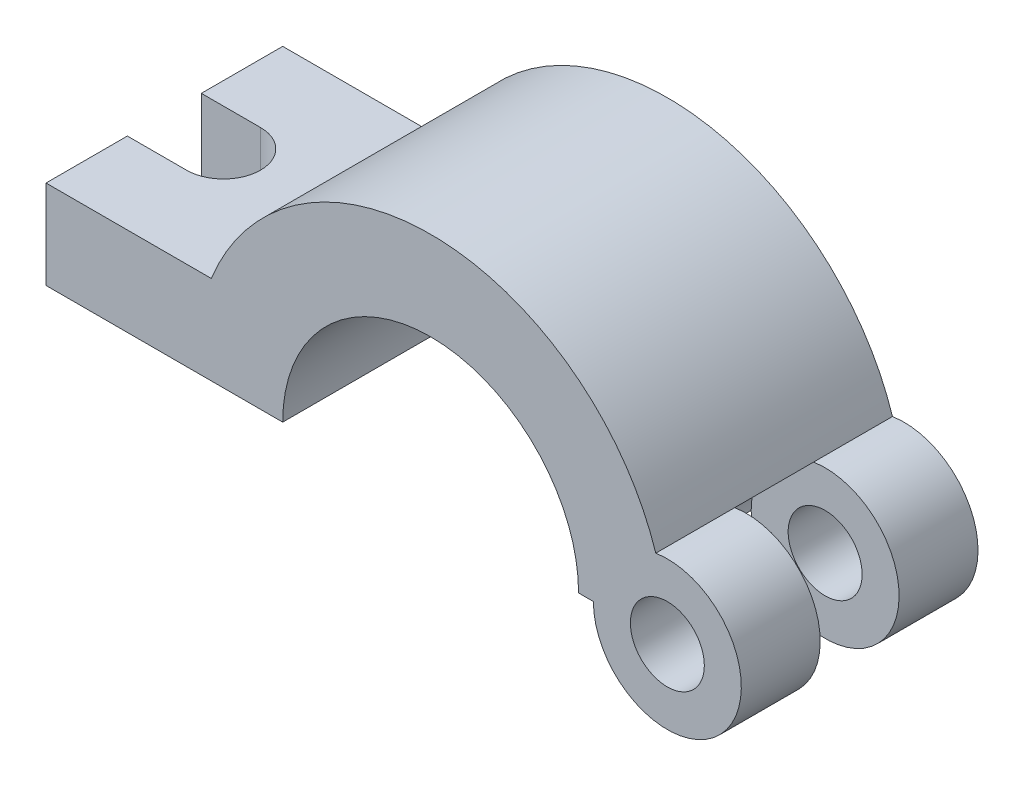
ISO-10303-21;
HEADER;
FILE_DESCRIPTION(('STEP AP214'),'2;1');
FILE_NAME('part.step','',(''),(''),'','','');
FILE_SCHEMA(('AUTOMOTIVE_DESIGN { 1 0 10303 214 1 1 1 1 }'));
ENDSEC;
DATA;
#1=APPLICATION_CONTEXT('core data for automotive mechanical design processes');
#2=APPLICATION_PROTOCOL_DEFINITION('international standard','automotive_design',2000,#1);
#3=PRODUCT_CONTEXT('',#1,'mechanical');
#4=PRODUCT('Part','Part','',(#3));
#5=PRODUCT_RELATED_PRODUCT_CATEGORY('part','',(#4));
#6=PRODUCT_DEFINITION_FORMATION('','',#4);
#7=PRODUCT_DEFINITION_CONTEXT('part definition',#1,'design');
#8=PRODUCT_DEFINITION('design','',#6,#7);
#9=PRODUCT_DEFINITION_SHAPE('','',#8);
#10=(LENGTH_UNIT() NAMED_UNIT(*) SI_UNIT(.MILLI.,.METRE.));
#11=(NAMED_UNIT(*) PLANE_ANGLE_UNIT() SI_UNIT($,.RADIAN.));
#12=(NAMED_UNIT(*) SI_UNIT($,.STERADIAN.) SOLID_ANGLE_UNIT());
#13=UNCERTAINTY_MEASURE_WITH_UNIT(LENGTH_MEASURE(1.E-05),#10,'distance_accuracy_value','');
#14=(GEOMETRIC_REPRESENTATION_CONTEXT(3) GLOBAL_UNCERTAINTY_ASSIGNED_CONTEXT((#13)) GLOBAL_UNIT_ASSIGNED_CONTEXT((#10,
#11,#12)) REPRESENTATION_CONTEXT('',''));
#15=CARTESIAN_POINT('',(0.,0.,0.));
#16=DIRECTION('',(0.,0.,1.));
#17=DIRECTION('',(1.,0.,0.));
#18=AXIS2_PLACEMENT_3D('',#15,#16,#17);
#19=CARTESIAN_POINT('',(0.,3.,4.));
#20=DIRECTION('',(0.,1.,0.));
#21=DIRECTION('',(-1.,0.,0.));
#22=AXIS2_PLACEMENT_3D('',#19,#20,#21);
#23=PLANE('',#22);
#24=CARTESIAN_POINT('',(-11.,3.,0.));
#25=DIRECTION('',(0.,1.,0.));
#26=DIRECTION('',(-1.,0.,0.));
#27=AXIS2_PLACEMENT_3D('',#24,#25,#26);
#28=CIRCLE('',#27,1.25);
#29=CARTESIAN_POINT('',(-11.,3.,1.25));
#30=VERTEX_POINT('',#29);
#31=CARTESIAN_POINT('',(-11.,3.,-1.25));
#32=VERTEX_POINT('',#31);
#33=EDGE_CURVE('E327',#30,#32,#28,.T.);
#34=ORIENTED_EDGE('',*,*,#33,.F.);
#35=DIRECTION('',(1.,0.,0.));
#36=VECTOR('',#35,1.);
#37=CARTESIAN_POINT('',(-13.,3.,1.25));
#38=LINE('',#37,#36);
#39=CARTESIAN_POINT('',(-13.,3.,1.25));
#40=VERTEX_POINT('',#39);
#41=EDGE_CURVE('E181',#40,#30,#38,.T.);
#42=ORIENTED_EDGE('',*,*,#41,.F.);
#43=DIRECTION('',(0.,0.,-1.));
#44=VECTOR('',#43,1.);
#45=CARTESIAN_POINT('',(-13.,3.,4.));
#46=LINE('',#45,#44);
#47=CARTESIAN_POINT('',(-13.,3.,4.));
#48=VERTEX_POINT('',#47);
#49=EDGE_CURVE('E46',#48,#40,#46,.T.);
#50=ORIENTED_EDGE('',*,*,#49,.F.);
#51=DIRECTION('',(1.,0.,0.));
#52=VECTOR('',#51,1.);
#53=CARTESIAN_POINT('',(0.,3.,4.));
#54=LINE('',#53,#52);
#55=CARTESIAN_POINT('',(-7.41619848709566,3.,4.));
#56=VERTEX_POINT('',#55);
#57=EDGE_CURVE('E209',#48,#56,#54,.T.);
#58=ORIENTED_EDGE('',*,*,#57,.T.);
#59=DIRECTION('',(0.,0.,-1.));
#60=VECTOR('',#59,1.);
#61=CARTESIAN_POINT('',(-7.41619848709566,3.,4.));
#62=LINE('',#61,#60);
#63=CARTESIAN_POINT('',(-7.41619848709566,3.,-4.));
#64=VERTEX_POINT('',#63);
#65=EDGE_CURVE('E11',#56,#64,#62,.T.);
#66=ORIENTED_EDGE('',*,*,#65,.T.);
#67=DIRECTION('',(1.,0.,0.));
#68=VECTOR('',#67,1.);
#69=CARTESIAN_POINT('',(0.,3.,-4.));
#70=LINE('',#69,#68);
#71=CARTESIAN_POINT('',(-13.,3.,-4.));
#72=VERTEX_POINT('',#71);
#73=EDGE_CURVE('E225',#72,#64,#70,.T.);
#74=ORIENTED_EDGE('',*,*,#73,.F.);
#75=CARTESIAN_POINT('',(-13.,3.,-1.25));
#76=VERTEX_POINT('',#75);
#77=EDGE_CURVE('E159',#76,#72,#46,.T.);
#78=ORIENTED_EDGE('',*,*,#77,.F.);
#79=DIRECTION('',(-1.,0.,0.));
#80=VECTOR('',#79,1.);
#81=CARTESIAN_POINT('',(-13.,3.,-1.25));
#82=LINE('',#81,#80);
#83=EDGE_CURVE('E138',#32,#76,#82,.T.);
#84=ORIENTED_EDGE('',*,*,#83,.F.);
#85=EDGE_LOOP('',(#34,#42,#50,#58,#66,#74,#78,#84));
#86=FACE_BOUND('',#85,.T.);
#87=ADVANCED_FACE('F37',(#86),#23,.T.);
#88=CARTESIAN_POINT('',(-13.,0.,4.));
#89=DIRECTION('',(-1.,0.,0.));
#90=DIRECTION('',(0.,0.,1.));
#91=AXIS2_PLACEMENT_3D('',#88,#89,#90);
#92=PLANE('',#91);
#93=ORIENTED_EDGE('',*,*,#49,.T.);
#94=DIRECTION('',(0.,-1.,0.));
#95=VECTOR('',#94,1.);
#96=CARTESIAN_POINT('',(-13.,40.4420799298589,1.25));
#97=LINE('',#96,#95);
#98=CARTESIAN_POINT('',(-13.,0.,1.25));
#99=VERTEX_POINT('',#98);
#100=EDGE_CURVE('E322',#40,#99,#97,.T.);
#101=ORIENTED_EDGE('',*,*,#100,.T.);
#102=DIRECTION('',(0.,0.,-1.));
#103=VECTOR('',#102,1.);
#104=CARTESIAN_POINT('',(-13.,0.,4.));
#105=LINE('',#104,#103);
#106=CARTESIAN_POINT('',(-13.,0.,4.));
#107=VERTEX_POINT('',#106);
#108=EDGE_CURVE('E155',#107,#99,#105,.T.);
#109=ORIENTED_EDGE('',*,*,#108,.F.);
#110=DIRECTION('',(0.,1.,0.));
#111=VECTOR('',#110,1.);
#112=CARTESIAN_POINT('',(-13.,0.,4.));
#113=LINE('',#112,#111);
#114=EDGE_CURVE('E213',#107,#48,#113,.T.);
#115=ORIENTED_EDGE('',*,*,#114,.T.);
#116=EDGE_LOOP('',(#93,#101,#109,#115));
#117=FACE_BOUND('',#116,.T.);
#118=ADVANCED_FACE('F283',(#117),#92,.T.);
#119=CARTESIAN_POINT('',(-13.,0.,-1.25));
#120=VERTEX_POINT('',#119);
#121=CARTESIAN_POINT('',(-13.,0.,-4.));
#122=VERTEX_POINT('',#121);
#123=EDGE_CURVE('E146',#120,#122,#105,.T.);
#124=ORIENTED_EDGE('',*,*,#123,.F.);
#125=DIRECTION('',(0.,-1.,0.));
#126=VECTOR('',#125,1.);
#127=CARTESIAN_POINT('',(-13.,40.4420799298589,-1.25));
#128=LINE('',#127,#126);
#129=EDGE_CURVE('E132',#76,#120,#128,.T.);
#130=ORIENTED_EDGE('',*,*,#129,.F.);
#131=ORIENTED_EDGE('',*,*,#77,.T.);
#132=DIRECTION('',(0.,1.,0.));
#133=VECTOR('',#132,1.);
#134=CARTESIAN_POINT('',(-13.,0.,-4.));
#135=LINE('',#134,#133);
#136=EDGE_CURVE('E154',#122,#72,#135,.T.);
#137=ORIENTED_EDGE('',*,*,#136,.F.);
#138=EDGE_LOOP('',(#124,#130,#131,#137));
#139=FACE_BOUND('',#138,.T.);
#140=ADVANCED_FACE('F152',(#139),#92,.T.);
#141=CARTESIAN_POINT('',(8.,0.,4.));
#142=DIRECTION('',(0.,0.,-1.));
#143=DIRECTION('',(-1.,0.,0.));
#144=AXIS2_PLACEMENT_3D('',#141,#142,#143);
#145=CYLINDRICAL_SURFACE('',#144,2.5);
#146=CARTESIAN_POINT('',(8.,0.,-1.33333333333333));
#147=DIRECTION('',(0.,0.,1.));
#148=DIRECTION('',(1.,0.,0.));
#149=AXIS2_PLACEMENT_3D('',#146,#147,#148);
#150=CIRCLE('',#149,2.5);
#151=CARTESIAN_POINT('',(5.5,0.,-1.33333333333333));
#152=VERTEX_POINT('',#151);
#153=CARTESIAN_POINT('',(7.609375,2.46929384832486,-1.33333333333333));
#154=VERTEX_POINT('',#153);
#155=EDGE_CURVE('E174',#152,#154,#150,.T.);
#156=ORIENTED_EDGE('',*,*,#155,.F.);
#157=DIRECTION('',(0.,0.,-1.));
#158=VECTOR('',#157,1.);
#159=CARTESIAN_POINT('',(5.5,0.,4.));
#160=LINE('',#159,#158);
#161=CARTESIAN_POINT('',(5.5,0.,-4.));
#162=VERTEX_POINT('',#161);
#163=EDGE_CURVE('E194',#152,#162,#160,.T.);
#164=ORIENTED_EDGE('',*,*,#163,.T.);
#165=CARTESIAN_POINT('',(8.,0.,-4.));
#166=DIRECTION('',(0.,0.,1.));
#167=DIRECTION('',(1.,0.,0.));
#168=AXIS2_PLACEMENT_3D('',#165,#166,#167);
#169=CIRCLE('',#168,2.5);
#170=CARTESIAN_POINT('',(7.609375,2.46929384832486,-4.));
#171=VERTEX_POINT('',#170);
#172=EDGE_CURVE('E190',#162,#171,#169,.T.);
#173=ORIENTED_EDGE('',*,*,#172,.T.);
#174=DIRECTION('',(0.,0.,-1.));
#175=VECTOR('',#174,1.);
#176=CARTESIAN_POINT('',(7.609375,2.46929384832486,0.));
#177=LINE('',#176,#175);
#178=EDGE_CURVE('E200',#154,#171,#177,.T.);
#179=ORIENTED_EDGE('',*,*,#178,.F.);
#180=EDGE_LOOP('',(#156,#164,#173,#179));
#181=FACE_BOUND('',#180,.T.);
#182=ADVANCED_FACE('F250',(#181),#145,.T.);
#183=CARTESIAN_POINT('',(8.,0.,-7.53553390593274));
#184=DIRECTION('',(0.,0.,1.));
#185=DIRECTION('',(1.,0.,0.));
#186=AXIS2_PLACEMENT_3D('',#183,#184,#185);
#187=CYLINDRICAL_SURFACE('',#186,1.25);
#188=CARTESIAN_POINT('',(8.,0.,-4.));
#189=DIRECTION('',(0.,0.,1.));
#190=DIRECTION('',(1.,0.,0.));
#191=AXIS2_PLACEMENT_3D('',#188,#189,#190);
#192=CIRCLE('',#191,1.25);
#193=CARTESIAN_POINT('',(9.25,0.,-4.));
#194=VERTEX_POINT('',#193);
#195=EDGE_CURVE('E187',#194,#194,#192,.F.);
#196=ORIENTED_EDGE('',*,*,#195,.T.);
#197=EDGE_LOOP('',(#196));
#198=FACE_BOUND('',#197,.T.);
#199=CARTESIAN_POINT('',(8.,0.,-1.33333333333333));
#200=DIRECTION('',(0.,0.,1.));
#201=DIRECTION('',(1.,0.,0.));
#202=AXIS2_PLACEMENT_3D('',#199,#200,#201);
#203=CIRCLE('',#202,1.25);
#204=CARTESIAN_POINT('',(9.25,0.,-1.33333333333333));
#205=VERTEX_POINT('',#204);
#206=EDGE_CURVE('E41',#205,#205,#203,.F.);
#207=ORIENTED_EDGE('',*,*,#206,.F.);
#208=EDGE_LOOP('',(#207));
#209=FACE_BOUND('',#208,.T.);
#210=ADVANCED_FACE('F273',(#198,#209),#187,.F.);
#211=CARTESIAN_POINT('',(0.,0.,4.));
#212=DIRECTION('',(0.,0.,-1.));
#213=DIRECTION('',(-1.,0.,0.));
#214=AXIS2_PLACEMENT_3D('',#211,#212,#213);
#215=CYLINDRICAL_SURFACE('',#214,8.);
#216=CARTESIAN_POINT('',(0.,0.,4.));
#217=DIRECTION('',(0.,0.,1.));
#218=DIRECTION('',(1.,0.,0.));
#219=AXIS2_PLACEMENT_3D('',#216,#217,#218);
#220=CIRCLE('',#219,8.);
#221=CARTESIAN_POINT('',(7.609375,2.46929384832486,4.));
#222=VERTEX_POINT('',#221);
#223=EDGE_CURVE('E207',#56,#222,#220,.F.);
#224=ORIENTED_EDGE('',*,*,#223,.T.);
#225=CARTESIAN_POINT('',(7.609375,2.46929384832486,1.33333333333333));
#226=VERTEX_POINT('',#225);
#227=EDGE_CURVE('E202',#222,#226,#177,.T.);
#228=ORIENTED_EDGE('',*,*,#227,.T.);
#229=EDGE_CURVE('E206',#226,#154,#177,.T.);
#230=ORIENTED_EDGE('',*,*,#229,.T.);
#231=ORIENTED_EDGE('',*,*,#178,.T.);
#232=CARTESIAN_POINT('',(0.,0.,-4.));
#233=DIRECTION('',(0.,0.,1.));
#234=DIRECTION('',(1.,0.,0.));
#235=AXIS2_PLACEMENT_3D('',#232,#233,#234);
#236=CIRCLE('',#235,8.);
#237=EDGE_CURVE('E205',#64,#171,#236,.F.);
#238=ORIENTED_EDGE('',*,*,#237,.F.);
#239=ORIENTED_EDGE('',*,*,#65,.F.);
#240=EDGE_LOOP('',(#224,#228,#230,#231,#238,#239));
#241=FACE_BOUND('',#240,.T.);
#242=ADVANCED_FACE('F39',(#241),#215,.T.);
#243=CARTESIAN_POINT('',(0.,0.,4.));
#244=DIRECTION('',(0.,1.,0.));
#245=DIRECTION('',(0.,0.,1.));
#246=AXIS2_PLACEMENT_3D('',#243,#244,#245);
#247=PLANE('',#246);
#248=CARTESIAN_POINT('',(5.5,0.,4.));
#249=VERTEX_POINT('',#248);
#250=CARTESIAN_POINT('',(5.5,0.,1.33333333333333));
#251=VERTEX_POINT('',#250);
#252=EDGE_CURVE('E197',#249,#251,#160,.T.);
#253=ORIENTED_EDGE('',*,*,#252,.F.);
#254=DIRECTION('',(1.,0.,0.));
#255=VECTOR('',#254,1.);
#256=CARTESIAN_POINT('',(0.,0.,4.));
#257=LINE('',#256,#255);
#258=CARTESIAN_POINT('',(5.,0.,4.));
#259=VERTEX_POINT('',#258);
#260=EDGE_CURVE('E220',#259,#249,#257,.T.);
#261=ORIENTED_EDGE('',*,*,#260,.F.);
#262=DIRECTION('',(0.,0.,-1.));
#263=VECTOR('',#262,1.);
#264=CARTESIAN_POINT('',(5.,0.,4.));
#265=LINE('',#264,#263);
#266=CARTESIAN_POINT('',(5.,0.,-4.));
#267=VERTEX_POINT('',#266);
#268=EDGE_CURVE('E161',#259,#267,#265,.T.);
#269=ORIENTED_EDGE('',*,*,#268,.T.);
#270=DIRECTION('',(1.,0.,0.));
#271=VECTOR('',#270,1.);
#272=CARTESIAN_POINT('',(0.,0.,-4.));
#273=LINE('',#272,#271);
#274=EDGE_CURVE('E210',#267,#162,#273,.T.);
#275=ORIENTED_EDGE('',*,*,#274,.T.);
#276=ORIENTED_EDGE('',*,*,#163,.F.);
#277=EDGE_CURVE('E201',#251,#152,#160,.T.);
#278=ORIENTED_EDGE('',*,*,#277,.F.);
#279=EDGE_LOOP('',(#253,#261,#269,#275,#276,#278));
#280=FACE_BOUND('',#279,.T.);
#281=ADVANCED_FACE('F239',(#280),#247,.F.);
#282=CARTESIAN_POINT('',(0.,0.,4.));
#283=DIRECTION('',(0.,1.,0.));
#284=DIRECTION('',(0.,0.,1.));
#285=AXIS2_PLACEMENT_3D('',#282,#283,#284);
#286=PLANE('',#285);
#287=CARTESIAN_POINT('',(-11.,0.,0.));
#288=DIRECTION('',(0.,1.,0.));
#289=DIRECTION('',(-1.,0.,0.));
#290=AXIS2_PLACEMENT_3D('',#287,#288,#289);
#291=CIRCLE('',#290,1.25);
#292=CARTESIAN_POINT('',(-11.,0.,1.25));
#293=VERTEX_POINT('',#292);
#294=CARTESIAN_POINT('',(-11.,0.,-1.25));
#295=VERTEX_POINT('',#294);
#296=EDGE_CURVE('E149',#293,#295,#291,.T.);
#297=ORIENTED_EDGE('',*,*,#296,.T.);
#298=DIRECTION('',(-1.,0.,0.));
#299=VECTOR('',#298,1.);
#300=CARTESIAN_POINT('',(-13.,0.,-1.25));
#301=LINE('',#300,#299);
#302=EDGE_CURVE('E135',#295,#120,#301,.T.);
#303=ORIENTED_EDGE('',*,*,#302,.T.);
#304=ORIENTED_EDGE('',*,*,#123,.T.);
#305=DIRECTION('',(1.,0.,0.));
#306=VECTOR('',#305,1.);
#307=CARTESIAN_POINT('',(0.,0.,-4.));
#308=LINE('',#307,#306);
#309=CARTESIAN_POINT('',(-5.,0.,-4.));
#310=VERTEX_POINT('',#309);
#311=EDGE_CURVE('E229',#122,#310,#308,.T.);
#312=ORIENTED_EDGE('',*,*,#311,.T.);
#313=DIRECTION('',(0.,0.,-1.));
#314=VECTOR('',#313,1.);
#315=CARTESIAN_POINT('',(-5.,0.,4.));
#316=LINE('',#315,#314);
#317=CARTESIAN_POINT('',(-5.,0.,4.));
#318=VERTEX_POINT('',#317);
#319=EDGE_CURVE('E156',#318,#310,#316,.T.);
#320=ORIENTED_EDGE('',*,*,#319,.F.);
#321=DIRECTION('',(1.,0.,0.));
#322=VECTOR('',#321,1.);
#323=CARTESIAN_POINT('',(0.,0.,4.));
#324=LINE('',#323,#322);
#325=EDGE_CURVE('E216',#107,#318,#324,.T.);
#326=ORIENTED_EDGE('',*,*,#325,.F.);
#327=ORIENTED_EDGE('',*,*,#108,.T.);
#328=DIRECTION('',(1.,0.,0.));
#329=VECTOR('',#328,1.);
#330=CARTESIAN_POINT('',(-13.,0.,1.25));
#331=LINE('',#330,#329);
#332=EDGE_CURVE('E142',#99,#293,#331,.T.);
#333=ORIENTED_EDGE('',*,*,#332,.T.);
#334=EDGE_LOOP('',(#297,#303,#304,#312,#320,#326,#327,#333));
#335=FACE_BOUND('',#334,.T.);
#336=ADVANCED_FACE('F145',(#335),#286,.F.);
#337=CARTESIAN_POINT('',(0.,0.,4.));
#338=DIRECTION('',(0.,0.,-1.));
#339=DIRECTION('',(-1.,0.,0.));
#340=AXIS2_PLACEMENT_3D('',#337,#338,#339);
#341=CYLINDRICAL_SURFACE('',#340,5.);
#342=CARTESIAN_POINT('',(0.,0.,-4.));
#343=DIRECTION('',(0.,0.,1.));
#344=DIRECTION('',(1.,0.,0.));
#345=AXIS2_PLACEMENT_3D('',#342,#343,#344);
#346=CIRCLE('',#345,5.);
#347=EDGE_CURVE('E231',#310,#267,#346,.F.);
#348=ORIENTED_EDGE('',*,*,#347,.T.);
#349=ORIENTED_EDGE('',*,*,#268,.F.);
#350=CARTESIAN_POINT('',(0.,0.,4.));
#351=DIRECTION('',(0.,0.,1.));
#352=DIRECTION('',(1.,0.,0.));
#353=AXIS2_PLACEMENT_3D('',#350,#351,#352);
#354=CIRCLE('',#353,5.);
#355=EDGE_CURVE('E218',#318,#259,#354,.F.);
#356=ORIENTED_EDGE('',*,*,#355,.F.);
#357=ORIENTED_EDGE('',*,*,#319,.T.);
#358=EDGE_LOOP('',(#348,#349,#356,#357));
#359=FACE_BOUND('',#358,.T.);
#360=ADVANCED_FACE('F267',(#359),#341,.F.);
#361=CARTESIAN_POINT('',(0.,0.,4.));
#362=DIRECTION('',(0.,0.,1.));
#363=DIRECTION('',(1.,0.,0.));
#364=AXIS2_PLACEMENT_3D('',#361,#362,#363);
#365=PLANE('',#364);
#366=CARTESIAN_POINT('',(8.,0.,4.));
#367=DIRECTION('',(0.,0.,1.));
#368=DIRECTION('',(1.,0.,0.));
#369=AXIS2_PLACEMENT_3D('',#366,#367,#368);
#370=CIRCLE('',#369,1.25);
#371=CARTESIAN_POINT('',(9.25,0.,4.));
#372=VERTEX_POINT('',#371);
#373=EDGE_CURVE('E172',#372,#372,#370,.T.);
#374=ORIENTED_EDGE('',*,*,#373,.F.);
#375=EDGE_LOOP('',(#374));
#376=FACE_BOUND('',#375,.T.);
#377=ORIENTED_EDGE('',*,*,#260,.T.);
#378=CARTESIAN_POINT('',(8.,0.,4.));
#379=DIRECTION('',(0.,0.,1.));
#380=DIRECTION('',(1.,0.,0.));
#381=AXIS2_PLACEMENT_3D('',#378,#379,#380);
#382=CIRCLE('',#381,2.5);
#383=EDGE_CURVE('E191',#249,#222,#382,.T.);
#384=ORIENTED_EDGE('',*,*,#383,.T.);
#385=ORIENTED_EDGE('',*,*,#223,.F.);
#386=ORIENTED_EDGE('',*,*,#57,.F.);
#387=ORIENTED_EDGE('',*,*,#114,.F.);
#388=ORIENTED_EDGE('',*,*,#325,.T.);
#389=ORIENTED_EDGE('',*,*,#355,.T.);
#390=EDGE_LOOP('',(#377,#384,#385,#386,#387,#388,#389));
#391=FACE_BOUND('',#390,.T.);
#392=ADVANCED_FACE('F262',(#376,#391),#365,.T.);
#393=CARTESIAN_POINT('',(0.,0.,-4.));
#394=DIRECTION('',(0.,0.,1.));
#395=DIRECTION('',(1.,0.,0.));
#396=AXIS2_PLACEMENT_3D('',#393,#394,#395);
#397=PLANE('',#396);
#398=ORIENTED_EDGE('',*,*,#195,.F.);
#399=EDGE_LOOP('',(#398));
#400=FACE_BOUND('',#399,.T.);
#401=ORIENTED_EDGE('',*,*,#237,.T.);
#402=ORIENTED_EDGE('',*,*,#172,.F.);
#403=ORIENTED_EDGE('',*,*,#274,.F.);
#404=ORIENTED_EDGE('',*,*,#347,.F.);
#405=ORIENTED_EDGE('',*,*,#311,.F.);
#406=ORIENTED_EDGE('',*,*,#136,.T.);
#407=ORIENTED_EDGE('',*,*,#73,.T.);
#408=EDGE_LOOP('',(#401,#402,#403,#404,#405,#406,#407));
#409=FACE_BOUND('',#408,.T.);
#410=ADVANCED_FACE('F246',(#400,#409),#397,.F.);
#411=ORIENTED_EDGE('',*,*,#252,.T.);
#412=CARTESIAN_POINT('',(8.,0.,1.33333333333333));
#413=DIRECTION('',(0.,0.,1.));
#414=DIRECTION('',(1.,0.,0.));
#415=AXIS2_PLACEMENT_3D('',#412,#413,#414);
#416=CIRCLE('',#415,2.5);
#417=EDGE_CURVE('E184',#251,#226,#416,.T.);
#418=ORIENTED_EDGE('',*,*,#417,.T.);
#419=ORIENTED_EDGE('',*,*,#227,.F.);
#420=ORIENTED_EDGE('',*,*,#383,.F.);
#421=EDGE_LOOP('',(#411,#418,#419,#420));
#422=FACE_BOUND('',#421,.T.);
#423=ADVANCED_FACE('F258',(#422),#145,.T.);
#424=CARTESIAN_POINT('',(8.,0.,1.33333333333333));
#425=DIRECTION('',(0.,0.,1.));
#426=DIRECTION('',(1.,0.,0.));
#427=AXIS2_PLACEMENT_3D('',#424,#425,#426);
#428=CIRCLE('',#427,1.25);
#429=CARTESIAN_POINT('',(9.25,0.,1.33333333333333));
#430=VERTEX_POINT('',#429);
#431=EDGE_CURVE('E166',#430,#430,#428,.F.);
#432=ORIENTED_EDGE('',*,*,#431,.T.);
#433=EDGE_LOOP('',(#432));
#434=FACE_BOUND('',#433,.T.);
#435=ORIENTED_EDGE('',*,*,#373,.T.);
#436=EDGE_LOOP('',(#435));
#437=FACE_BOUND('',#436,.T.);
#438=ADVANCED_FACE('F281',(#434,#437),#187,.F.);
#439=CARTESIAN_POINT('',(8.,0.,-1.33333333333333));
#440=DIRECTION('',(0.,0.,1.));
#441=DIRECTION('',(1.,0.,0.));
#442=AXIS2_PLACEMENT_3D('',#439,#440,#441);
#443=PLANE('',#442);
#444=EDGE_CURVE('E168',#154,#152,#150,.T.);
#445=ORIENTED_EDGE('',*,*,#444,.T.);
#446=ORIENTED_EDGE('',*,*,#155,.T.);
#447=EDGE_LOOP('',(#445,#446));
#448=FACE_BOUND('',#447,.T.);
#449=ORIENTED_EDGE('',*,*,#206,.T.);
#450=EDGE_LOOP('',(#449));
#451=FACE_BOUND('',#450,.T.);
#452=ADVANCED_FACE('F303',(#448,#451),#443,.T.);
#453=CARTESIAN_POINT('',(8.,0.,1.33333333333333));
#454=DIRECTION('',(0.,0.,1.));
#455=DIRECTION('',(1.,0.,0.));
#456=AXIS2_PLACEMENT_3D('',#453,#454,#455);
#457=PLANE('',#456);
#458=EDGE_CURVE('E61',#226,#251,#416,.T.);
#459=ORIENTED_EDGE('',*,*,#458,.F.);
#460=ORIENTED_EDGE('',*,*,#417,.F.);
#461=EDGE_LOOP('',(#459,#460));
#462=FACE_BOUND('',#461,.T.);
#463=ORIENTED_EDGE('',*,*,#431,.F.);
#464=EDGE_LOOP('',(#463));
#465=FACE_BOUND('',#464,.T.);
#466=ADVANCED_FACE('F307',(#462,#465),#457,.F.);
#467=CARTESIAN_POINT('',(8.,0.,-1.33333333333333));
#468=DIRECTION('',(0.,0.,1.));
#469=DIRECTION('',(1.,0.,0.));
#470=AXIS2_PLACEMENT_3D('',#467,#468,#469);
#471=CYLINDRICAL_SURFACE('',#470,2.5);
#472=ORIENTED_EDGE('',*,*,#229,.F.);
#473=ORIENTED_EDGE('',*,*,#458,.T.);
#474=ORIENTED_EDGE('',*,*,#277,.T.);
#475=ORIENTED_EDGE('',*,*,#444,.F.);
#476=EDGE_LOOP('',(#472,#473,#474,#475));
#477=FACE_BOUND('',#476,.T.);
#478=ADVANCED_FACE('F254',(#477),#471,.F.);
#479=CARTESIAN_POINT('',(-13.,40.4420799298589,1.25));
#480=DIRECTION('',(0.,0.,-1.));
#481=DIRECTION('',(-1.,0.,0.));
#482=AXIS2_PLACEMENT_3D('',#479,#480,#481);
#483=PLANE('',#482);
#484=ORIENTED_EDGE('',*,*,#100,.F.);
#485=ORIENTED_EDGE('',*,*,#41,.T.);
#486=DIRECTION('',(0.,-1.,0.));
#487=VECTOR('',#486,1.);
#488=CARTESIAN_POINT('',(-11.,40.4420799298589,1.25));
#489=LINE('',#488,#487);
#490=EDGE_CURVE('E326',#30,#293,#489,.T.);
#491=ORIENTED_EDGE('',*,*,#490,.T.);
#492=ORIENTED_EDGE('',*,*,#332,.F.);
#493=EDGE_LOOP('',(#484,#485,#491,#492));
#494=FACE_BOUND('',#493,.T.);
#495=ADVANCED_FACE('F306',(#494),#483,.T.);
#496=CARTESIAN_POINT('',(-11.,40.4420799298589,0.));
#497=DIRECTION('',(0.,-1.,0.));
#498=DIRECTION('',(1.,0.,0.));
#499=AXIS2_PLACEMENT_3D('',#496,#497,#498);
#500=CYLINDRICAL_SURFACE('',#499,1.25);
#501=ORIENTED_EDGE('',*,*,#490,.F.);
#502=ORIENTED_EDGE('',*,*,#33,.T.);
#503=DIRECTION('',(0.,-1.,0.));
#504=VECTOR('',#503,1.);
#505=CARTESIAN_POINT('',(-11.,40.4420799298589,-1.25));
#506=LINE('',#505,#504);
#507=EDGE_CURVE('E54',#32,#295,#506,.T.);
#508=ORIENTED_EDGE('',*,*,#507,.T.);
#509=ORIENTED_EDGE('',*,*,#296,.F.);
#510=EDGE_LOOP('',(#501,#502,#508,#509));
#511=FACE_BOUND('',#510,.T.);
#512=ADVANCED_FACE('F314',(#511),#500,.F.);
#513=CARTESIAN_POINT('',(-13.,40.4420799298589,-1.25));
#514=DIRECTION('',(0.,0.,1.));
#515=DIRECTION('',(1.,0.,0.));
#516=AXIS2_PLACEMENT_3D('',#513,#514,#515);
#517=PLANE('',#516);
#518=ORIENTED_EDGE('',*,*,#507,.F.);
#519=ORIENTED_EDGE('',*,*,#83,.T.);
#520=ORIENTED_EDGE('',*,*,#129,.T.);
#521=ORIENTED_EDGE('',*,*,#302,.F.);
#522=EDGE_LOOP('',(#518,#519,#520,#521));
#523=FACE_BOUND('',#522,.T.);
#524=ADVANCED_FACE('F134',(#523),#517,.T.);
#525=CLOSED_SHELL('',(#87,#118,#140,#182,#210,#242,#281,#336,#360,#392,#410,#423,#438,#452,#466,
#478,#495,#512,#524));
#526=MANIFOLD_SOLID_BREP('B2',#525);
#527=ADVANCED_BREP_SHAPE_REPRESENTATION('',(#18,#526),#14);
#528=SHAPE_DEFINITION_REPRESENTATION(#9,#527);
ENDSEC;
END-ISO-10303-21;
